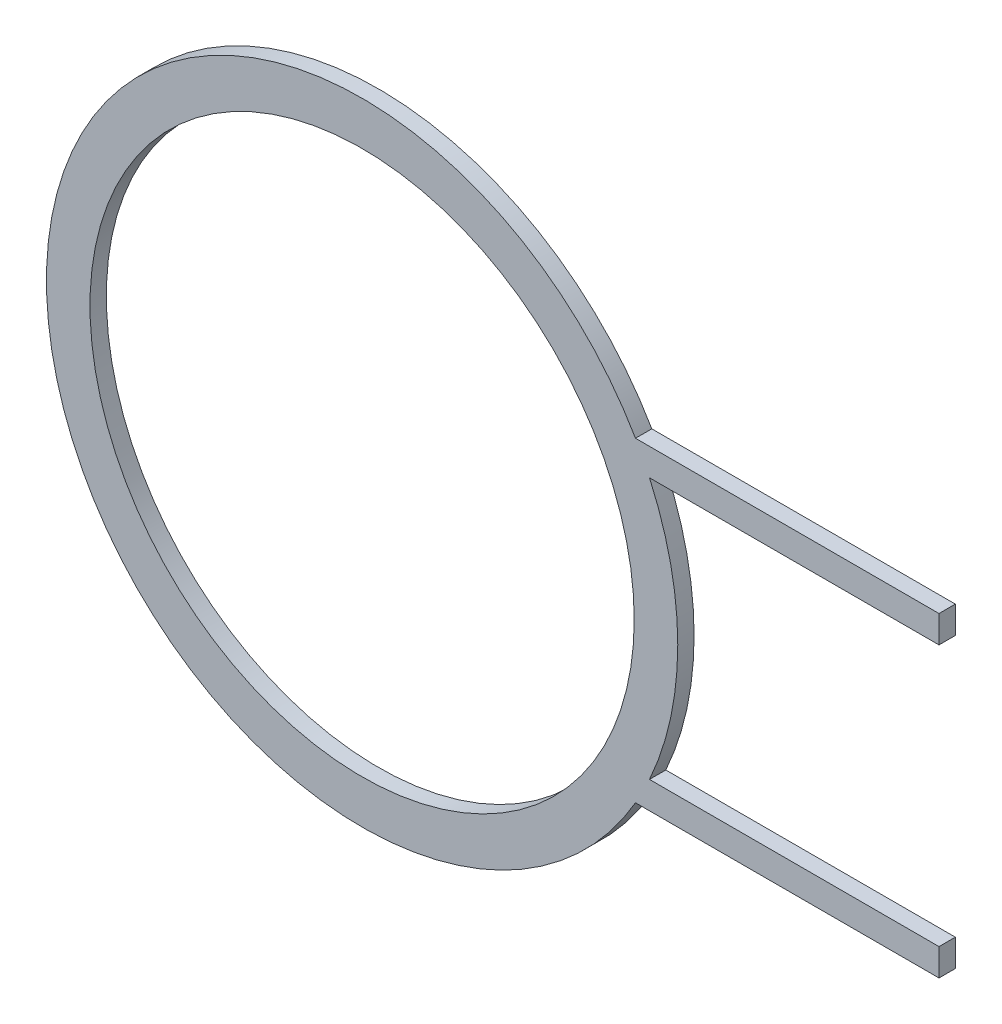
ISO-10303-21;
HEADER;
FILE_DESCRIPTION(('STEP AP214'),'2;1');
FILE_NAME('part.step','',(''),(''),'','','');
FILE_SCHEMA(('AUTOMOTIVE_DESIGN { 1 0 10303 214 1 1 1 1 }'));
ENDSEC;
DATA;
#1=APPLICATION_CONTEXT('core data for automotive mechanical design processes');
#2=APPLICATION_PROTOCOL_DEFINITION('international standard','automotive_design',2000,#1);
#3=PRODUCT_CONTEXT('',#1,'mechanical');
#4=PRODUCT('Part','Part','',(#3));
#5=PRODUCT_RELATED_PRODUCT_CATEGORY('part','',(#4));
#6=PRODUCT_DEFINITION_FORMATION('','',#4);
#7=PRODUCT_DEFINITION_CONTEXT('part definition',#1,'design');
#8=PRODUCT_DEFINITION('design','',#6,#7);
#9=PRODUCT_DEFINITION_SHAPE('','',#8);
#10=(LENGTH_UNIT() NAMED_UNIT(*) SI_UNIT(.MILLI.,.METRE.));
#11=(NAMED_UNIT(*) PLANE_ANGLE_UNIT() SI_UNIT($,.RADIAN.));
#12=(NAMED_UNIT(*) SI_UNIT($,.STERADIAN.) SOLID_ANGLE_UNIT());
#13=UNCERTAINTY_MEASURE_WITH_UNIT(LENGTH_MEASURE(1.E-05),#10,'distance_accuracy_value','');
#14=(GEOMETRIC_REPRESENTATION_CONTEXT(3) GLOBAL_UNCERTAINTY_ASSIGNED_CONTEXT((#13)) GLOBAL_UNIT_ASSIGNED_CONTEXT((#10,
#11,#12)) REPRESENTATION_CONTEXT('',''));
#15=CARTESIAN_POINT('',(0.,0.,0.));
#16=DIRECTION('',(0.,0.,1.));
#17=DIRECTION('',(1.,0.,0.));
#18=AXIS2_PLACEMENT_3D('',#15,#16,#17);
#19=CARTESIAN_POINT('',(106.,24.,3.));
#20=DIRECTION('',(-1.,0.,0.));
#21=DIRECTION('',(0.,0.,1.));
#22=AXIS2_PLACEMENT_3D('',#19,#20,#21);
#23=PLANE('',#22);
#24=DIRECTION('',(0.,1.,0.));
#25=VECTOR('',#24,1.);
#26=CARTESIAN_POINT('',(106.,24.,0.));
#27=LINE('',#26,#25);
#28=CARTESIAN_POINT('',(106.,24.,0.));
#29=VERTEX_POINT('',#28);
#30=CARTESIAN_POINT('',(106.,29.,0.));
#31=VERTEX_POINT('',#30);
#32=EDGE_CURVE('E130',#29,#31,#27,.T.);
#33=ORIENTED_EDGE('',*,*,#32,.T.);
#34=DIRECTION('',(0.,0.,-1.));
#35=VECTOR('',#34,1.);
#36=CARTESIAN_POINT('',(106.,29.,3.));
#37=LINE('',#36,#35);
#38=CARTESIAN_POINT('',(106.,29.,3.));
#39=VERTEX_POINT('',#38);
#40=EDGE_CURVE('E11',#39,#31,#37,.T.);
#41=ORIENTED_EDGE('',*,*,#40,.F.);
#42=DIRECTION('',(0.,1.,0.));
#43=VECTOR('',#42,1.);
#44=CARTESIAN_POINT('',(106.,24.,3.));
#45=LINE('',#44,#43);
#46=CARTESIAN_POINT('',(106.,24.,3.));
#47=VERTEX_POINT('',#46);
#48=EDGE_CURVE('E150',#47,#39,#45,.T.);
#49=ORIENTED_EDGE('',*,*,#48,.F.);
#50=DIRECTION('',(0.,0.,-1.));
#51=VECTOR('',#50,1.);
#52=CARTESIAN_POINT('',(106.,24.,3.));
#53=LINE('',#52,#51);
#54=EDGE_CURVE('E49',#47,#29,#53,.T.);
#55=ORIENTED_EDGE('',*,*,#54,.T.);
#56=EDGE_LOOP('',(#33,#41,#49,#55));
#57=FACE_BOUND('',#56,.T.);
#58=ADVANCED_FACE('F33',(#57),#23,.F.);
#59=CARTESIAN_POINT('',(106.,29.,3.));
#60=DIRECTION('',(0.,-1.,0.));
#61=DIRECTION('',(0.,0.,-1.));
#62=AXIS2_PLACEMENT_3D('',#59,#60,#61);
#63=PLANE('',#62);
#64=DIRECTION('',(-1.,0.,0.));
#65=VECTOR('',#64,1.);
#66=CARTESIAN_POINT('',(106.,29.,0.));
#67=LINE('',#66,#65);
#68=CARTESIAN_POINT('',(50.2294734194974,29.,0.));
#69=VERTEX_POINT('',#68);
#70=EDGE_CURVE('E132',#31,#69,#67,.T.);
#71=ORIENTED_EDGE('',*,*,#70,.T.);
#72=DIRECTION('',(0.,0.,-1.));
#73=VECTOR('',#72,1.);
#74=CARTESIAN_POINT('',(50.2294734194974,29.,3.));
#75=LINE('',#74,#73);
#76=CARTESIAN_POINT('',(50.2294734194974,29.,3.));
#77=VERTEX_POINT('',#76);
#78=EDGE_CURVE('E41',#77,#69,#75,.T.);
#79=ORIENTED_EDGE('',*,*,#78,.F.);
#80=DIRECTION('',(-1.,0.,0.));
#81=VECTOR('',#80,1.);
#82=CARTESIAN_POINT('',(106.,29.,3.));
#83=LINE('',#82,#81);
#84=EDGE_CURVE('E88',#39,#77,#83,.T.);
#85=ORIENTED_EDGE('',*,*,#84,.F.);
#86=ORIENTED_EDGE('',*,*,#40,.T.);
#87=EDGE_LOOP('',(#71,#79,#85,#86));
#88=FACE_BOUND('',#87,.T.);
#89=ADVANCED_FACE('F200',(#88),#63,.F.);
#90=CARTESIAN_POINT('',(0.,0.,3.));
#91=DIRECTION('',(0.,0.,-1.));
#92=DIRECTION('',(-1.,0.,0.));
#93=AXIS2_PLACEMENT_3D('',#90,#91,#92);
#94=CYLINDRICAL_SURFACE('',#93,58.);
#95=CARTESIAN_POINT('',(0.,0.,0.));
#96=DIRECTION('',(0.,0.,1.));
#97=DIRECTION('',(1.,0.,0.));
#98=AXIS2_PLACEMENT_3D('',#95,#96,#97);
#99=CIRCLE('',#98,58.);
#100=CARTESIAN_POINT('',(50.2294734194974,-29.,0.));
#101=VERTEX_POINT('',#100);
#102=EDGE_CURVE('E135',#69,#101,#99,.T.);
#103=ORIENTED_EDGE('',*,*,#102,.T.);
#104=DIRECTION('',(0.,0.,-1.));
#105=VECTOR('',#104,1.);
#106=CARTESIAN_POINT('',(50.2294734194974,-29.,3.));
#107=LINE('',#106,#105);
#108=CARTESIAN_POINT('',(50.2294734194974,-29.,3.));
#109=VERTEX_POINT('',#108);
#110=EDGE_CURVE('E156',#109,#101,#107,.T.);
#111=ORIENTED_EDGE('',*,*,#110,.F.);
#112=CARTESIAN_POINT('',(0.,0.,3.));
#113=DIRECTION('',(0.,0.,1.));
#114=DIRECTION('',(1.,0.,0.));
#115=AXIS2_PLACEMENT_3D('',#112,#113,#114);
#116=CIRCLE('',#115,58.);
#117=EDGE_CURVE('E163',#77,#109,#116,.T.);
#118=ORIENTED_EDGE('',*,*,#117,.F.);
#119=ORIENTED_EDGE('',*,*,#78,.T.);
#120=EDGE_LOOP('',(#103,#111,#118,#119));
#121=FACE_BOUND('',#120,.T.);
#122=ADVANCED_FACE('F161',(#121),#94,.T.);
#123=CARTESIAN_POINT('',(106.,-29.,3.));
#124=DIRECTION('',(0.,-1.,0.));
#125=DIRECTION('',(0.,0.,-1.));
#126=AXIS2_PLACEMENT_3D('',#123,#124,#125);
#127=PLANE('',#126);
#128=DIRECTION('',(-1.,0.,0.));
#129=VECTOR('',#128,1.);
#130=CARTESIAN_POINT('',(106.,-29.,0.));
#131=LINE('',#130,#129);
#132=CARTESIAN_POINT('',(106.,-29.,0.));
#133=VERTEX_POINT('',#132);
#134=EDGE_CURVE('E138',#133,#101,#131,.T.);
#135=ORIENTED_EDGE('',*,*,#134,.F.);
#136=DIRECTION('',(0.,0.,-1.));
#137=VECTOR('',#136,1.);
#138=CARTESIAN_POINT('',(106.,-29.,3.));
#139=LINE('',#138,#137);
#140=CARTESIAN_POINT('',(106.,-29.,3.));
#141=VERTEX_POINT('',#140);
#142=EDGE_CURVE('E154',#141,#133,#139,.T.);
#143=ORIENTED_EDGE('',*,*,#142,.F.);
#144=DIRECTION('',(-1.,0.,0.));
#145=VECTOR('',#144,1.);
#146=CARTESIAN_POINT('',(106.,-29.,3.));
#147=LINE('',#146,#145);
#148=EDGE_CURVE('E171',#141,#109,#147,.T.);
#149=ORIENTED_EDGE('',*,*,#148,.T.);
#150=ORIENTED_EDGE('',*,*,#110,.T.);
#151=EDGE_LOOP('',(#135,#143,#149,#150));
#152=FACE_BOUND('',#151,.T.);
#153=ADVANCED_FACE('F169',(#152),#127,.T.);
#154=CARTESIAN_POINT('',(106.,-24.,3.));
#155=DIRECTION('',(1.,0.,0.));
#156=DIRECTION('',(0.,0.,-1.));
#157=AXIS2_PLACEMENT_3D('',#154,#155,#156);
#158=PLANE('',#157);
#159=DIRECTION('',(0.,-1.,0.));
#160=VECTOR('',#159,1.);
#161=CARTESIAN_POINT('',(106.,-24.,0.));
#162=LINE('',#161,#160);
#163=CARTESIAN_POINT('',(106.,-24.,0.));
#164=VERTEX_POINT('',#163);
#165=EDGE_CURVE('E141',#164,#133,#162,.T.);
#166=ORIENTED_EDGE('',*,*,#165,.F.);
#167=DIRECTION('',(0.,0.,-1.));
#168=VECTOR('',#167,1.);
#169=CARTESIAN_POINT('',(106.,-24.,3.));
#170=LINE('',#169,#168);
#171=CARTESIAN_POINT('',(106.,-24.,3.));
#172=VERTEX_POINT('',#171);
#173=EDGE_CURVE('E122',#172,#164,#170,.T.);
#174=ORIENTED_EDGE('',*,*,#173,.F.);
#175=DIRECTION('',(0.,-1.,0.));
#176=VECTOR('',#175,1.);
#177=CARTESIAN_POINT('',(106.,-24.,3.));
#178=LINE('',#177,#176);
#179=EDGE_CURVE('E112',#172,#141,#178,.T.);
#180=ORIENTED_EDGE('',*,*,#179,.T.);
#181=ORIENTED_EDGE('',*,*,#142,.T.);
#182=EDGE_LOOP('',(#166,#174,#180,#181));
#183=FACE_BOUND('',#182,.T.);
#184=ADVANCED_FACE('F206',(#183),#158,.T.);
#185=CARTESIAN_POINT('',(106.,-24.,3.));
#186=DIRECTION('',(0.,-1.,0.));
#187=DIRECTION('',(0.,0.,-1.));
#188=AXIS2_PLACEMENT_3D('',#185,#186,#187);
#189=PLANE('',#188);
#190=DIRECTION('',(-1.,0.,0.));
#191=VECTOR('',#190,1.);
#192=CARTESIAN_POINT('',(106.,-24.,0.));
#193=LINE('',#192,#191);
#194=CARTESIAN_POINT('',(52.8015151297763,-24.,0.));
#195=VERTEX_POINT('',#194);
#196=EDGE_CURVE('E119',#164,#195,#193,.T.);
#197=ORIENTED_EDGE('',*,*,#196,.T.);
#198=DIRECTION('',(0.,0.,-1.));
#199=VECTOR('',#198,1.);
#200=CARTESIAN_POINT('',(52.8015151297763,-24.,3.));
#201=LINE('',#200,#199);
#202=CARTESIAN_POINT('',(52.8015151297763,-24.,3.));
#203=VERTEX_POINT('',#202);
#204=EDGE_CURVE('E116',#203,#195,#201,.T.);
#205=ORIENTED_EDGE('',*,*,#204,.F.);
#206=DIRECTION('',(-1.,0.,0.));
#207=VECTOR('',#206,1.);
#208=CARTESIAN_POINT('',(106.,-24.,3.));
#209=LINE('',#208,#207);
#210=EDGE_CURVE('E104',#172,#203,#209,.T.);
#211=ORIENTED_EDGE('',*,*,#210,.F.);
#212=ORIENTED_EDGE('',*,*,#173,.T.);
#213=EDGE_LOOP('',(#197,#205,#211,#212));
#214=FACE_BOUND('',#213,.T.);
#215=ADVANCED_FACE('F117',(#214),#189,.F.);
#216=CARTESIAN_POINT('',(0.,0.,3.));
#217=DIRECTION('',(0.,0.,-1.));
#218=DIRECTION('',(-1.,0.,0.));
#219=AXIS2_PLACEMENT_3D('',#216,#217,#218);
#220=CYLINDRICAL_SURFACE('',#219,58.);
#221=CARTESIAN_POINT('',(0.,0.,0.));
#222=DIRECTION('',(0.,0.,1.));
#223=DIRECTION('',(1.,0.,0.));
#224=AXIS2_PLACEMENT_3D('',#221,#222,#223);
#225=CIRCLE('',#224,58.);
#226=CARTESIAN_POINT('',(52.8015151297763,24.,0.));
#227=VERTEX_POINT('',#226);
#228=EDGE_CURVE('E145',#195,#227,#225,.T.);
#229=ORIENTED_EDGE('',*,*,#228,.T.);
#230=DIRECTION('',(0.,0.,-1.));
#231=VECTOR('',#230,1.);
#232=CARTESIAN_POINT('',(52.8015151297763,24.,3.));
#233=LINE('',#232,#231);
#234=CARTESIAN_POINT('',(52.8015151297763,24.,3.));
#235=VERTEX_POINT('',#234);
#236=EDGE_CURVE('E76',#235,#227,#233,.T.);
#237=ORIENTED_EDGE('',*,*,#236,.F.);
#238=CARTESIAN_POINT('',(0.,0.,3.));
#239=DIRECTION('',(0.,0.,1.));
#240=DIRECTION('',(1.,0.,0.));
#241=AXIS2_PLACEMENT_3D('',#238,#239,#240);
#242=CIRCLE('',#241,58.);
#243=EDGE_CURVE('E109',#203,#235,#242,.T.);
#244=ORIENTED_EDGE('',*,*,#243,.F.);
#245=ORIENTED_EDGE('',*,*,#204,.T.);
#246=EDGE_LOOP('',(#229,#237,#244,#245));
#247=FACE_BOUND('',#246,.T.);
#248=ADVANCED_FACE('F124',(#247),#220,.T.);
#249=CARTESIAN_POINT('',(106.,24.,3.));
#250=DIRECTION('',(0.,-1.,0.));
#251=DIRECTION('',(0.,0.,-1.));
#252=AXIS2_PLACEMENT_3D('',#249,#250,#251);
#253=PLANE('',#252);
#254=DIRECTION('',(-1.,0.,0.));
#255=VECTOR('',#254,1.);
#256=CARTESIAN_POINT('',(106.,24.,0.));
#257=LINE('',#256,#255);
#258=EDGE_CURVE('E147',#29,#227,#257,.T.);
#259=ORIENTED_EDGE('',*,*,#258,.F.);
#260=ORIENTED_EDGE('',*,*,#54,.F.);
#261=DIRECTION('',(-1.,0.,0.));
#262=VECTOR('',#261,1.);
#263=CARTESIAN_POINT('',(106.,24.,3.));
#264=LINE('',#263,#262);
#265=EDGE_CURVE('E125',#47,#235,#264,.T.);
#266=ORIENTED_EDGE('',*,*,#265,.T.);
#267=ORIENTED_EDGE('',*,*,#236,.T.);
#268=EDGE_LOOP('',(#259,#260,#266,#267));
#269=FACE_BOUND('',#268,.T.);
#270=ADVANCED_FACE('F191',(#269),#253,.T.);
#271=CARTESIAN_POINT('',(0.,0.,3.));
#272=DIRECTION('',(0.,0.,1.));
#273=DIRECTION('',(1.,0.,0.));
#274=AXIS2_PLACEMENT_3D('',#271,#272,#273);
#275=PLANE('',#274);
#276=CARTESIAN_POINT('',(0.,0.,3.));
#277=DIRECTION('',(0.,0.,1.));
#278=DIRECTION('',(1.,0.,0.));
#279=AXIS2_PLACEMENT_3D('',#276,#277,#278);
#280=CIRCLE('',#279,50.);
#281=CARTESIAN_POINT('',(50.,0.,3.));
#282=VERTEX_POINT('',#281);
#283=EDGE_CURVE('E177',#282,#282,#280,.T.);
#284=ORIENTED_EDGE('',*,*,#283,.F.);
#285=EDGE_LOOP('',(#284));
#286=FACE_BOUND('',#285,.T.);
#287=ORIENTED_EDGE('',*,*,#48,.T.);
#288=ORIENTED_EDGE('',*,*,#84,.T.);
#289=ORIENTED_EDGE('',*,*,#117,.T.);
#290=ORIENTED_EDGE('',*,*,#148,.F.);
#291=ORIENTED_EDGE('',*,*,#179,.F.);
#292=ORIENTED_EDGE('',*,*,#210,.T.);
#293=ORIENTED_EDGE('',*,*,#243,.T.);
#294=ORIENTED_EDGE('',*,*,#265,.F.);
#295=EDGE_LOOP('',(#287,#288,#289,#290,#291,#292,#293,#294));
#296=FACE_BOUND('',#295,.T.);
#297=ADVANCED_FACE('F106',(#286,#296),#275,.T.);
#298=CARTESIAN_POINT('',(0.,0.,0.));
#299=DIRECTION('',(0.,0.,1.));
#300=DIRECTION('',(1.,0.,0.));
#301=AXIS2_PLACEMENT_3D('',#298,#299,#300);
#302=PLANE('',#301);
#303=CARTESIAN_POINT('',(0.,0.,0.));
#304=DIRECTION('',(0.,0.,1.));
#305=DIRECTION('',(1.,0.,0.));
#306=AXIS2_PLACEMENT_3D('',#303,#304,#305);
#307=CIRCLE('',#306,50.);
#308=CARTESIAN_POINT('',(50.,0.,0.));
#309=VERTEX_POINT('',#308);
#310=EDGE_CURVE('E133',#309,#309,#307,.T.);
#311=ORIENTED_EDGE('',*,*,#310,.T.);
#312=EDGE_LOOP('',(#311));
#313=FACE_BOUND('',#312,.T.);
#314=ORIENTED_EDGE('',*,*,#32,.F.);
#315=ORIENTED_EDGE('',*,*,#258,.T.);
#316=ORIENTED_EDGE('',*,*,#228,.F.);
#317=ORIENTED_EDGE('',*,*,#196,.F.);
#318=ORIENTED_EDGE('',*,*,#165,.T.);
#319=ORIENTED_EDGE('',*,*,#134,.T.);
#320=ORIENTED_EDGE('',*,*,#102,.F.);
#321=ORIENTED_EDGE('',*,*,#70,.F.);
#322=EDGE_LOOP('',(#314,#315,#316,#317,#318,#319,#320,#321));
#323=FACE_BOUND('',#322,.T.);
#324=ADVANCED_FACE('F165',(#313,#323),#302,.F.);
#325=CARTESIAN_POINT('',(0.,0.,0.));
#326=DIRECTION('',(0.,0.,1.));
#327=DIRECTION('',(1.,0.,0.));
#328=AXIS2_PLACEMENT_3D('',#325,#326,#327);
#329=CYLINDRICAL_SURFACE('',#328,50.);
#330=ORIENTED_EDGE('',*,*,#310,.F.);
#331=EDGE_LOOP('',(#330));
#332=FACE_BOUND('',#331,.T.);
#333=ORIENTED_EDGE('',*,*,#283,.T.);
#334=EDGE_LOOP('',(#333));
#335=FACE_BOUND('',#334,.T.);
#336=ADVANCED_FACE('F184',(#332,#335),#329,.F.);
#337=CLOSED_SHELL('',(#58,#89,#122,#153,#184,#215,#248,#270,#297,#324,#336));
#338=MANIFOLD_SOLID_BREP('B2',#337);
#339=ADVANCED_BREP_SHAPE_REPRESENTATION('',(#18,#338),#14);
#340=SHAPE_DEFINITION_REPRESENTATION(#9,#339);
ENDSEC;
END-ISO-10303-21;
